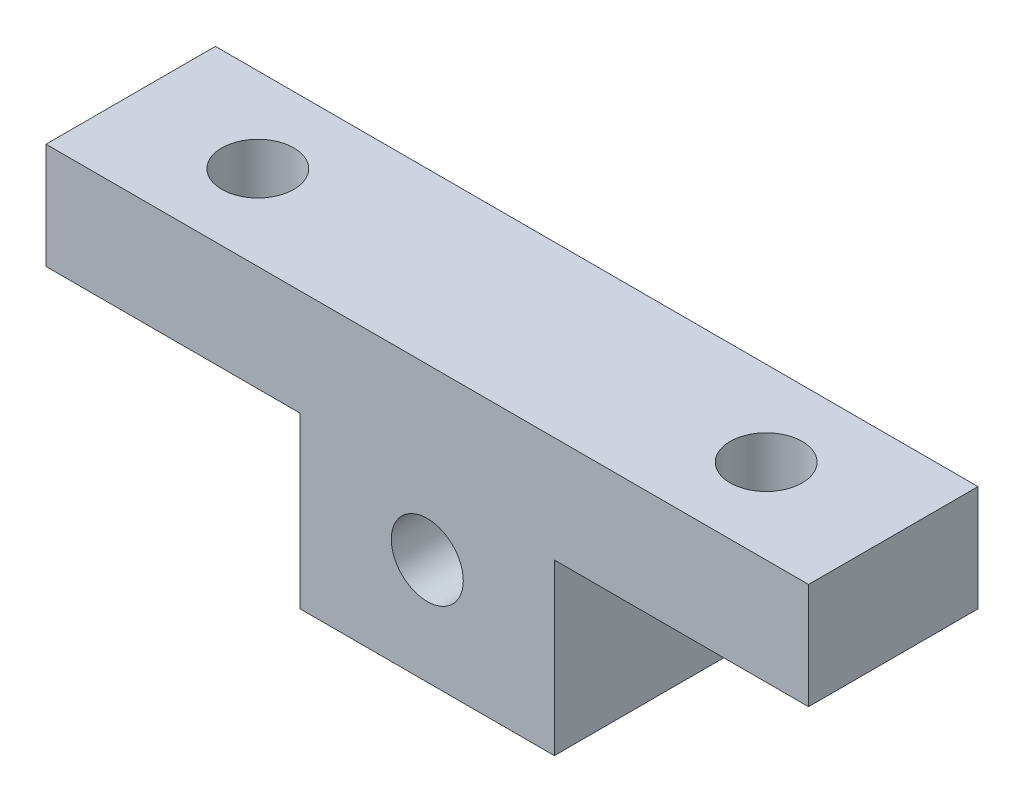
ISO-10303-21;
HEADER;
FILE_DESCRIPTION(('STEP AP214'),'2;1');
FILE_NAME('part.step','',(''),(''),'','','');
FILE_SCHEMA(('AUTOMOTIVE_DESIGN { 1 0 10303 214 1 1 1 1 }'));
ENDSEC;
DATA;
#1=APPLICATION_CONTEXT('core data for automotive mechanical design processes');
#2=APPLICATION_PROTOCOL_DEFINITION('international standard','automotive_design',2000,#1);
#3=PRODUCT_CONTEXT('',#1,'mechanical');
#4=PRODUCT('Part','Part','',(#3));
#5=PRODUCT_RELATED_PRODUCT_CATEGORY('part','',(#4));
#6=PRODUCT_DEFINITION_FORMATION('','',#4);
#7=PRODUCT_DEFINITION_CONTEXT('part definition',#1,'design');
#8=PRODUCT_DEFINITION('design','',#6,#7);
#9=PRODUCT_DEFINITION_SHAPE('','',#8);
#10=(LENGTH_UNIT() NAMED_UNIT(*) SI_UNIT(.MILLI.,.METRE.));
#11=(NAMED_UNIT(*) PLANE_ANGLE_UNIT() SI_UNIT($,.RADIAN.));
#12=(NAMED_UNIT(*) SI_UNIT($,.STERADIAN.) SOLID_ANGLE_UNIT());
#13=UNCERTAINTY_MEASURE_WITH_UNIT(LENGTH_MEASURE(1.E-05),#10,'distance_accuracy_value','');
#14=(GEOMETRIC_REPRESENTATION_CONTEXT(3) GLOBAL_UNCERTAINTY_ASSIGNED_CONTEXT((#13)) GLOBAL_UNIT_ASSIGNED_CONTEXT((#10,
#11,#12)) REPRESENTATION_CONTEXT('',''));
#15=CARTESIAN_POINT('',(0.,0.,0.));
#16=DIRECTION('',(0.,0.,1.));
#17=DIRECTION('',(1.,0.,0.));
#18=AXIS2_PLACEMENT_3D('',#15,#16,#17);
#19=CARTESIAN_POINT('',(12.,0.,8.));
#20=DIRECTION('',(0.,1.,0.));
#21=DIRECTION('',(-1.,0.,0.));
#22=AXIS2_PLACEMENT_3D('',#19,#20,#21);
#23=PLANE('',#22);
#24=CARTESIAN_POINT('',(6.,0.,4.));
#25=DIRECTION('',(0.,-1.,0.));
#26=DIRECTION('',(0.,0.,-1.));
#27=AXIS2_PLACEMENT_3D('',#24,#25,#26);
#28=CIRCLE('',#27,1.69999999999999);
#29=CARTESIAN_POINT('',(6.,0.,2.30000000000001));
#30=VERTEX_POINT('',#29);
#31=EDGE_CURVE('E191',#30,#30,#28,.T.);
#32=ORIENTED_EDGE('',*,*,#31,.F.);
#33=EDGE_LOOP('',(#32));
#34=FACE_BOUND('',#33,.T.);
#35=DIRECTION('',(1.,0.,0.));
#36=VECTOR('',#35,1.);
#37=CARTESIAN_POINT('',(12.,0.,0.));
#38=LINE('',#37,#36);
#39=CARTESIAN_POINT('',(0.,0.,0.));
#40=VERTEX_POINT('',#39);
#41=CARTESIAN_POINT('',(12.,0.,0.));
#42=VERTEX_POINT('',#41);
#43=EDGE_CURVE('E129',#40,#42,#38,.T.);
#44=ORIENTED_EDGE('',*,*,#43,.T.);
#45=DIRECTION('',(0.,0.,-1.));
#46=VECTOR('',#45,1.);
#47=CARTESIAN_POINT('',(12.,0.,8.));
#48=LINE('',#47,#46);
#49=CARTESIAN_POINT('',(12.,0.,8.));
#50=VERTEX_POINT('',#49);
#51=EDGE_CURVE('E11',#50,#42,#48,.T.);
#52=ORIENTED_EDGE('',*,*,#51,.F.);
#53=DIRECTION('',(1.,0.,0.));
#54=VECTOR('',#53,1.);
#55=CARTESIAN_POINT('',(12.,0.,8.));
#56=LINE('',#55,#54);
#57=CARTESIAN_POINT('',(0.,0.,8.));
#58=VERTEX_POINT('',#57);
#59=EDGE_CURVE('E144',#58,#50,#56,.T.);
#60=ORIENTED_EDGE('',*,*,#59,.F.);
#61=DIRECTION('',(0.,0.,-1.));
#62=VECTOR('',#61,1.);
#63=CARTESIAN_POINT('',(0.,0.,8.));
#64=LINE('',#63,#62);
#65=EDGE_CURVE('E125',#58,#40,#64,.T.);
#66=ORIENTED_EDGE('',*,*,#65,.T.);
#67=EDGE_LOOP('',(#44,#52,#60,#66));
#68=FACE_BOUND('',#67,.T.);
#69=ADVANCED_FACE('F33',(#34,#68),#23,.F.);
#70=CARTESIAN_POINT('',(12.,-8.,8.));
#71=DIRECTION('',(1.,0.,0.));
#72=DIRECTION('',(0.,0.,-1.));
#73=AXIS2_PLACEMENT_3D('',#70,#71,#72);
#74=PLANE('',#73);
#75=DIRECTION('',(0.,-1.,0.));
#76=VECTOR('',#75,1.);
#77=CARTESIAN_POINT('',(12.,-8.,0.));
#78=LINE('',#77,#76);
#79=CARTESIAN_POINT('',(12.,-8.,0.));
#80=VERTEX_POINT('',#79);
#81=EDGE_CURVE('E132',#42,#80,#78,.T.);
#82=ORIENTED_EDGE('',*,*,#81,.T.);
#83=DIRECTION('',(0.,0.,-1.));
#84=VECTOR('',#83,1.);
#85=CARTESIAN_POINT('',(12.,-8.,8.));
#86=LINE('',#85,#84);
#87=CARTESIAN_POINT('',(12.,-8.,8.));
#88=VERTEX_POINT('',#87);
#89=EDGE_CURVE('E41',#88,#80,#86,.T.);
#90=ORIENTED_EDGE('',*,*,#89,.F.);
#91=DIRECTION('',(0.,-1.,0.));
#92=VECTOR('',#91,1.);
#93=CARTESIAN_POINT('',(12.,-8.,8.));
#94=LINE('',#93,#92);
#95=EDGE_CURVE('E92',#50,#88,#94,.T.);
#96=ORIENTED_EDGE('',*,*,#95,.F.);
#97=ORIENTED_EDGE('',*,*,#51,.T.);
#98=EDGE_LOOP('',(#82,#90,#96,#97));
#99=FACE_BOUND('',#98,.T.);
#100=ADVANCED_FACE('F199',(#99),#74,.F.);
#101=CARTESIAN_POINT('',(24.,-7.99999999999999,8.));
#102=DIRECTION('',(0.,1.,0.));
#103=DIRECTION('',(-1.,0.,0.));
#104=AXIS2_PLACEMENT_3D('',#101,#102,#103);
#105=PLANE('',#104);
#106=DIRECTION('',(1.,0.,0.));
#107=VECTOR('',#106,1.);
#108=CARTESIAN_POINT('',(24.,-7.99999999999999,0.));
#109=LINE('',#108,#107);
#110=CARTESIAN_POINT('',(24.,-7.99999999999999,0.));
#111=VERTEX_POINT('',#110);
#112=EDGE_CURVE('E135',#80,#111,#109,.T.);
#113=ORIENTED_EDGE('',*,*,#112,.T.);
#114=DIRECTION('',(0.,0.,-1.));
#115=VECTOR('',#114,1.);
#116=CARTESIAN_POINT('',(24.,-7.99999999999999,8.));
#117=LINE('',#116,#115);
#118=CARTESIAN_POINT('',(24.,-7.99999999999999,8.));
#119=VERTEX_POINT('',#118);
#120=EDGE_CURVE('E151',#119,#111,#117,.T.);
#121=ORIENTED_EDGE('',*,*,#120,.F.);
#122=DIRECTION('',(1.,0.,0.));
#123=VECTOR('',#122,1.);
#124=CARTESIAN_POINT('',(24.,-7.99999999999999,8.));
#125=LINE('',#124,#123);
#126=EDGE_CURVE('E159',#88,#119,#125,.T.);
#127=ORIENTED_EDGE('',*,*,#126,.F.);
#128=ORIENTED_EDGE('',*,*,#89,.T.);
#129=EDGE_LOOP('',(#113,#121,#127,#128));
#130=FACE_BOUND('',#129,.T.);
#131=ADVANCED_FACE('F157',(#130),#105,.F.);
#132=CARTESIAN_POINT('',(24.,0.,8.));
#133=DIRECTION('',(-1.,0.,0.));
#134=DIRECTION('',(0.,0.,1.));
#135=AXIS2_PLACEMENT_3D('',#132,#133,#134);
#136=PLANE('',#135);
#137=DIRECTION('',(0.,1.,0.));
#138=VECTOR('',#137,1.);
#139=CARTESIAN_POINT('',(24.,0.,0.));
#140=LINE('',#139,#138);
#141=CARTESIAN_POINT('',(24.,0.,0.));
#142=VERTEX_POINT('',#141);
#143=EDGE_CURVE('E137',#111,#142,#140,.T.);
#144=ORIENTED_EDGE('',*,*,#143,.T.);
#145=DIRECTION('',(0.,0.,-1.));
#146=VECTOR('',#145,1.);
#147=CARTESIAN_POINT('',(24.,0.,8.));
#148=LINE('',#147,#146);
#149=CARTESIAN_POINT('',(24.,0.,8.));
#150=VERTEX_POINT('',#149);
#151=EDGE_CURVE('E148',#150,#142,#148,.T.);
#152=ORIENTED_EDGE('',*,*,#151,.F.);
#153=DIRECTION('',(0.,1.,0.));
#154=VECTOR('',#153,1.);
#155=CARTESIAN_POINT('',(24.,0.,8.));
#156=LINE('',#155,#154);
#157=EDGE_CURVE('E171',#119,#150,#156,.T.);
#158=ORIENTED_EDGE('',*,*,#157,.F.);
#159=ORIENTED_EDGE('',*,*,#120,.T.);
#160=EDGE_LOOP('',(#144,#152,#158,#159));
#161=FACE_BOUND('',#160,.T.);
#162=ADVANCED_FACE('F167',(#161),#136,.F.);
#163=CARTESIAN_POINT('',(36.,0.,8.));
#164=DIRECTION('',(0.,1.,0.));
#165=DIRECTION('',(-1.,0.,0.));
#166=AXIS2_PLACEMENT_3D('',#163,#164,#165);
#167=PLANE('',#166);
#168=CARTESIAN_POINT('',(30.,0.,4.));
#169=DIRECTION('',(0.,-1.,0.));
#170=DIRECTION('',(0.,0.,-1.));
#171=AXIS2_PLACEMENT_3D('',#168,#169,#170);
#172=CIRCLE('',#171,1.69999999999999);
#173=CARTESIAN_POINT('',(30.,0.,2.30000000000002));
#174=VERTEX_POINT('',#173);
#175=EDGE_CURVE('E185',#174,#174,#172,.T.);
#176=ORIENTED_EDGE('',*,*,#175,.F.);
#177=EDGE_LOOP('',(#176));
#178=FACE_BOUND('',#177,.T.);
#179=DIRECTION('',(1.,0.,0.));
#180=VECTOR('',#179,1.);
#181=CARTESIAN_POINT('',(36.,0.,0.));
#182=LINE('',#181,#180);
#183=CARTESIAN_POINT('',(36.,0.,0.));
#184=VERTEX_POINT('',#183);
#185=EDGE_CURVE('E139',#142,#184,#182,.T.);
#186=ORIENTED_EDGE('',*,*,#185,.T.);
#187=DIRECTION('',(0.,0.,-1.));
#188=VECTOR('',#187,1.);
#189=CARTESIAN_POINT('',(36.,0.,8.));
#190=LINE('',#189,#188);
#191=CARTESIAN_POINT('',(36.,0.,8.));
#192=VERTEX_POINT('',#191);
#193=EDGE_CURVE('E120',#192,#184,#190,.T.);
#194=ORIENTED_EDGE('',*,*,#193,.F.);
#195=DIRECTION('',(1.,0.,0.));
#196=VECTOR('',#195,1.);
#197=CARTESIAN_POINT('',(36.,0.,8.));
#198=LINE('',#197,#196);
#199=EDGE_CURVE('E111',#150,#192,#198,.T.);
#200=ORIENTED_EDGE('',*,*,#199,.F.);
#201=ORIENTED_EDGE('',*,*,#151,.T.);
#202=EDGE_LOOP('',(#186,#194,#200,#201));
#203=FACE_BOUND('',#202,.T.);
#204=ADVANCED_FACE('F170',(#178,#203),#167,.F.);
#205=CARTESIAN_POINT('',(36.,5.,8.));
#206=DIRECTION('',(-1.,0.,0.));
#207=DIRECTION('',(0.,0.,1.));
#208=AXIS2_PLACEMENT_3D('',#205,#206,#207);
#209=PLANE('',#208);
#210=DIRECTION('',(0.,1.,0.));
#211=VECTOR('',#210,1.);
#212=CARTESIAN_POINT('',(36.,5.,0.));
#213=LINE('',#212,#211);
#214=CARTESIAN_POINT('',(36.,5.,0.));
#215=VERTEX_POINT('',#214);
#216=EDGE_CURVE('E119',#184,#215,#213,.T.);
#217=ORIENTED_EDGE('',*,*,#216,.T.);
#218=DIRECTION('',(0.,0.,-1.));
#219=VECTOR('',#218,1.);
#220=CARTESIAN_POINT('',(36.,5.,8.));
#221=LINE('',#220,#219);
#222=CARTESIAN_POINT('',(36.,5.,8.));
#223=VERTEX_POINT('',#222);
#224=EDGE_CURVE('E116',#223,#215,#221,.T.);
#225=ORIENTED_EDGE('',*,*,#224,.F.);
#226=DIRECTION('',(0.,1.,0.));
#227=VECTOR('',#226,1.);
#228=CARTESIAN_POINT('',(36.,5.,8.));
#229=LINE('',#228,#227);
#230=EDGE_CURVE('E105',#192,#223,#229,.T.);
#231=ORIENTED_EDGE('',*,*,#230,.F.);
#232=ORIENTED_EDGE('',*,*,#193,.T.);
#233=EDGE_LOOP('',(#217,#225,#231,#232));
#234=FACE_BOUND('',#233,.T.);
#235=ADVANCED_FACE('F117',(#234),#209,.F.);
#236=CARTESIAN_POINT('',(0.,5.,8.));
#237=DIRECTION('',(0.,-1.,0.));
#238=DIRECTION('',(0.,0.,-1.));
#239=AXIS2_PLACEMENT_3D('',#236,#237,#238);
#240=PLANE('',#239);
#241=CARTESIAN_POINT('',(6.,5.,4.));
#242=DIRECTION('',(0.,-1.,0.));
#243=DIRECTION('',(0.,0.,-1.));
#244=AXIS2_PLACEMENT_3D('',#241,#242,#243);
#245=CIRCLE('',#244,1.7);
#246=CARTESIAN_POINT('',(6.,5.,2.3));
#247=VERTEX_POINT('',#246);
#248=EDGE_CURVE('E188',#247,#247,#245,.T.);
#249=ORIENTED_EDGE('',*,*,#248,.T.);
#250=EDGE_LOOP('',(#249));
#251=FACE_BOUND('',#250,.T.);
#252=CARTESIAN_POINT('',(30.,5.,4.));
#253=DIRECTION('',(0.,-1.,0.));
#254=DIRECTION('',(0.,0.,-1.));
#255=AXIS2_PLACEMENT_3D('',#252,#253,#254);
#256=CIRCLE('',#255,1.7);
#257=CARTESIAN_POINT('',(30.,5.,2.3));
#258=VERTEX_POINT('',#257);
#259=EDGE_CURVE('E182',#258,#258,#256,.T.);
#260=ORIENTED_EDGE('',*,*,#259,.T.);
#261=EDGE_LOOP('',(#260));
#262=FACE_BOUND('',#261,.T.);
#263=DIRECTION('',(-1.,0.,0.));
#264=VECTOR('',#263,1.);
#265=CARTESIAN_POINT('',(0.,5.,0.));
#266=LINE('',#265,#264);
#267=CARTESIAN_POINT('',(0.,5.,0.));
#268=VERTEX_POINT('',#267);
#269=EDGE_CURVE('E78',#215,#268,#266,.T.);
#270=ORIENTED_EDGE('',*,*,#269,.T.);
#271=DIRECTION('',(0.,0.,-1.));
#272=VECTOR('',#271,1.);
#273=CARTESIAN_POINT('',(0.,5.,8.));
#274=LINE('',#273,#272);
#275=CARTESIAN_POINT('',(0.,5.,8.));
#276=VERTEX_POINT('',#275);
#277=EDGE_CURVE('E121',#276,#268,#274,.T.);
#278=ORIENTED_EDGE('',*,*,#277,.F.);
#279=DIRECTION('',(-1.,0.,0.));
#280=VECTOR('',#279,1.);
#281=CARTESIAN_POINT('',(0.,5.,8.));
#282=LINE('',#281,#280);
#283=EDGE_CURVE('E109',#223,#276,#282,.T.);
#284=ORIENTED_EDGE('',*,*,#283,.F.);
#285=ORIENTED_EDGE('',*,*,#224,.T.);
#286=EDGE_LOOP('',(#270,#278,#284,#285));
#287=FACE_BOUND('',#286,.T.);
#288=ADVANCED_FACE('F123',(#251,#262,#287),#240,.F.);
#289=CARTESIAN_POINT('',(0.,0.,8.));
#290=DIRECTION('',(1.,0.,0.));
#291=DIRECTION('',(0.,0.,-1.));
#292=AXIS2_PLACEMENT_3D('',#289,#290,#291);
#293=PLANE('',#292);
#294=DIRECTION('',(0.,-1.,0.));
#295=VECTOR('',#294,1.);
#296=CARTESIAN_POINT('',(0.,0.,0.));
#297=LINE('',#296,#295);
#298=EDGE_CURVE('E84',#268,#40,#297,.T.);
#299=ORIENTED_EDGE('',*,*,#298,.T.);
#300=ORIENTED_EDGE('',*,*,#65,.F.);
#301=DIRECTION('',(0.,-1.,0.));
#302=VECTOR('',#301,1.);
#303=CARTESIAN_POINT('',(0.,0.,8.));
#304=LINE('',#303,#302);
#305=EDGE_CURVE('E49',#276,#58,#304,.T.);
#306=ORIENTED_EDGE('',*,*,#305,.F.);
#307=ORIENTED_EDGE('',*,*,#277,.T.);
#308=EDGE_LOOP('',(#299,#300,#306,#307));
#309=FACE_BOUND('',#308,.T.);
#310=ADVANCED_FACE('F202',(#309),#293,.F.);
#311=CARTESIAN_POINT('',(0.,0.,8.));
#312=DIRECTION('',(0.,0.,-1.));
#313=DIRECTION('',(-1.,0.,0.));
#314=AXIS2_PLACEMENT_3D('',#311,#312,#313);
#315=PLANE('',#314);
#316=CARTESIAN_POINT('',(18.,-3.,8.));
#317=DIRECTION('',(0.,0.,1.));
#318=DIRECTION('',(1.,0.,0.));
#319=AXIS2_PLACEMENT_3D('',#316,#317,#318);
#320=CIRCLE('',#319,1.7);
#321=CARTESIAN_POINT('',(19.7,-3.,8.));
#322=VERTEX_POINT('',#321);
#323=EDGE_CURVE('E179',#322,#322,#320,.T.);
#324=ORIENTED_EDGE('',*,*,#323,.F.);
#325=EDGE_LOOP('',(#324));
#326=FACE_BOUND('',#325,.T.);
#327=ORIENTED_EDGE('',*,*,#59,.T.);
#328=ORIENTED_EDGE('',*,*,#95,.T.);
#329=ORIENTED_EDGE('',*,*,#126,.T.);
#330=ORIENTED_EDGE('',*,*,#157,.T.);
#331=ORIENTED_EDGE('',*,*,#199,.T.);
#332=ORIENTED_EDGE('',*,*,#230,.T.);
#333=ORIENTED_EDGE('',*,*,#283,.T.);
#334=ORIENTED_EDGE('',*,*,#305,.T.);
#335=EDGE_LOOP('',(#327,#328,#329,#330,#331,#332,#333,#334));
#336=FACE_BOUND('',#335,.T.);
#337=ADVANCED_FACE('F107',(#326,#336),#315,.F.);
#338=CARTESIAN_POINT('',(0.,0.,0.));
#339=DIRECTION('',(0.,0.,-1.));
#340=DIRECTION('',(-1.,0.,0.));
#341=AXIS2_PLACEMENT_3D('',#338,#339,#340);
#342=PLANE('',#341);
#343=CARTESIAN_POINT('',(18.,-3.,0.));
#344=DIRECTION('',(0.,0.,1.));
#345=DIRECTION('',(1.,0.,0.));
#346=AXIS2_PLACEMENT_3D('',#343,#344,#345);
#347=CIRCLE('',#346,1.7);
#348=CARTESIAN_POINT('',(19.7,-3.,0.));
#349=VERTEX_POINT('',#348);
#350=EDGE_CURVE('E133',#349,#349,#347,.T.);
#351=ORIENTED_EDGE('',*,*,#350,.T.);
#352=EDGE_LOOP('',(#351));
#353=FACE_BOUND('',#352,.T.);
#354=ORIENTED_EDGE('',*,*,#43,.F.);
#355=ORIENTED_EDGE('',*,*,#298,.F.);
#356=ORIENTED_EDGE('',*,*,#269,.F.);
#357=ORIENTED_EDGE('',*,*,#216,.F.);
#358=ORIENTED_EDGE('',*,*,#185,.F.);
#359=ORIENTED_EDGE('',*,*,#143,.F.);
#360=ORIENTED_EDGE('',*,*,#112,.F.);
#361=ORIENTED_EDGE('',*,*,#81,.F.);
#362=EDGE_LOOP('',(#354,#355,#356,#357,#358,#359,#360,#361));
#363=FACE_BOUND('',#362,.T.);
#364=ADVANCED_FACE('F163',(#353,#363),#342,.T.);
#365=CARTESIAN_POINT('',(18.,-3.,8.));
#366=DIRECTION('',(0.,0.,1.));
#367=DIRECTION('',(1.,0.,0.));
#368=AXIS2_PLACEMENT_3D('',#365,#366,#367);
#369=CYLINDRICAL_SURFACE('',#368,1.7);
#370=ORIENTED_EDGE('',*,*,#350,.F.);
#371=EDGE_LOOP('',(#370));
#372=FACE_BOUND('',#371,.T.);
#373=ORIENTED_EDGE('',*,*,#323,.T.);
#374=EDGE_LOOP('',(#373));
#375=FACE_BOUND('',#374,.T.);
#376=ADVANCED_FACE('F259',(#372,#375),#369,.F.);
#377=CARTESIAN_POINT('',(30.,0.,4.));
#378=DIRECTION('',(0.,-1.,0.));
#379=DIRECTION('',(0.,0.,-1.));
#380=AXIS2_PLACEMENT_3D('',#377,#378,#379);
#381=CYLINDRICAL_SURFACE('',#380,1.69999999999999);
#382=ORIENTED_EDGE('',*,*,#259,.F.);
#383=EDGE_LOOP('',(#382));
#384=FACE_BOUND('',#383,.T.);
#385=ORIENTED_EDGE('',*,*,#175,.T.);
#386=EDGE_LOOP('',(#385));
#387=FACE_BOUND('',#386,.T.);
#388=ADVANCED_FACE('F254',(#384,#387),#381,.F.);
#389=CARTESIAN_POINT('',(6.,0.,4.));
#390=DIRECTION('',(0.,-1.,0.));
#391=DIRECTION('',(0.,0.,-1.));
#392=AXIS2_PLACEMENT_3D('',#389,#390,#391);
#393=CYLINDRICAL_SURFACE('',#392,1.69999999999999);
#394=ORIENTED_EDGE('',*,*,#248,.F.);
#395=EDGE_LOOP('',(#394));
#396=FACE_BOUND('',#395,.T.);
#397=ORIENTED_EDGE('',*,*,#31,.T.);
#398=EDGE_LOOP('',(#397));
#399=FACE_BOUND('',#398,.T.);
#400=ADVANCED_FACE('F195',(#396,#399),#393,.F.);
#401=CLOSED_SHELL('',(#69,#100,#131,#162,#204,#235,#288,#310,#337,#364,#376,#388,#400));
#402=MANIFOLD_SOLID_BREP('B2',#401);
#403=ADVANCED_BREP_SHAPE_REPRESENTATION('',(#18,#402),#14);
#404=SHAPE_DEFINITION_REPRESENTATION(#9,#403);
ENDSEC;
END-ISO-10303-21;
